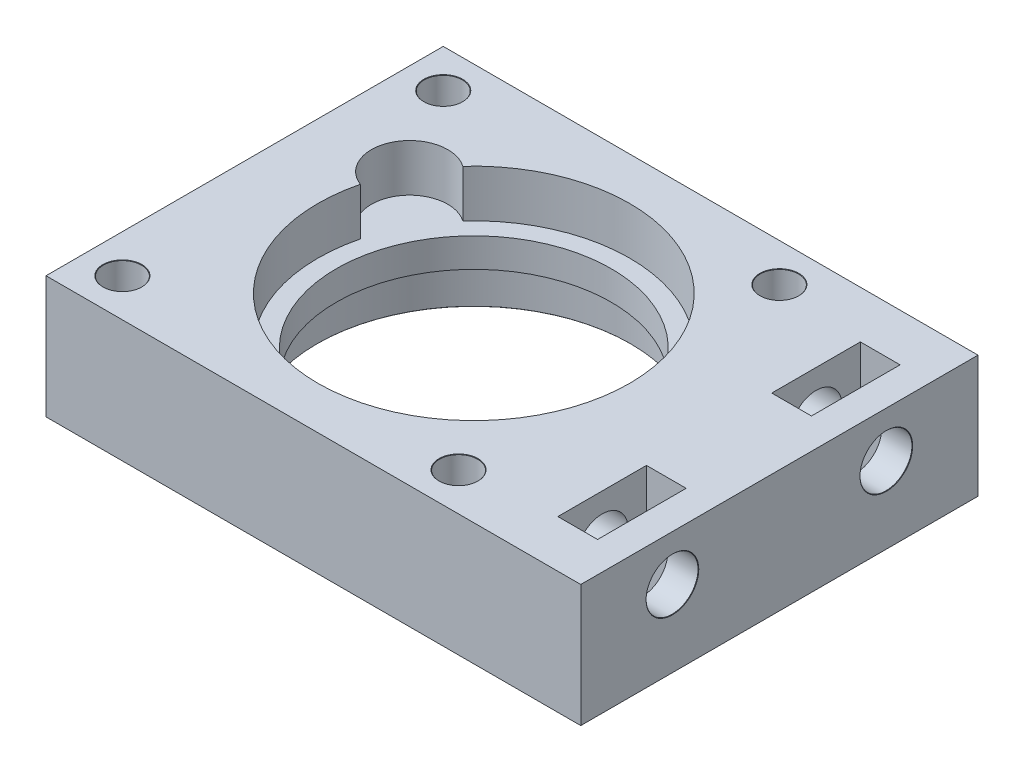
ISO-10303-21;
HEADER;
FILE_DESCRIPTION(('STEP AP214'),'2;1');
FILE_NAME('part.step','',(''),(''),'','','');
FILE_SCHEMA(('AUTOMOTIVE_DESIGN { 1 0 10303 214 1 1 1 1 }'));
ENDSEC;
DATA;
#1=APPLICATION_CONTEXT('core data for automotive mechanical design processes');
#2=APPLICATION_PROTOCOL_DEFINITION('international standard','automotive_design',2000,#1);
#3=PRODUCT_CONTEXT('',#1,'mechanical');
#4=PRODUCT('Part','Part','',(#3));
#5=PRODUCT_RELATED_PRODUCT_CATEGORY('part','',(#4));
#6=PRODUCT_DEFINITION_FORMATION('','',#4);
#7=PRODUCT_DEFINITION_CONTEXT('part definition',#1,'design');
#8=PRODUCT_DEFINITION('design','',#6,#7);
#9=PRODUCT_DEFINITION_SHAPE('','',#8);
#10=(LENGTH_UNIT() NAMED_UNIT(*) SI_UNIT(.MILLI.,.METRE.));
#11=(NAMED_UNIT(*) PLANE_ANGLE_UNIT() SI_UNIT($,.RADIAN.));
#12=(NAMED_UNIT(*) SI_UNIT($,.STERADIAN.) SOLID_ANGLE_UNIT());
#13=UNCERTAINTY_MEASURE_WITH_UNIT(LENGTH_MEASURE(1.E-05),#10,'distance_accuracy_value','');
#14=(GEOMETRIC_REPRESENTATION_CONTEXT(3) GLOBAL_UNCERTAINTY_ASSIGNED_CONTEXT((#13)) GLOBAL_UNIT_ASSIGNED_CONTEXT((#10,
#11,#12)) REPRESENTATION_CONTEXT('',''));
#15=CARTESIAN_POINT('',(0.,0.,0.));
#16=DIRECTION('',(0.,0.,1.));
#17=DIRECTION('',(1.,0.,0.));
#18=AXIS2_PLACEMENT_3D('',#15,#16,#17);
#19=CARTESIAN_POINT('',(35.,5.,-20.));
#20=DIRECTION('',(1.,0.,0.));
#21=DIRECTION('',(0.,0.,-1.));
#22=AXIS2_PLACEMENT_3D('',#19,#20,#21);
#23=CYLINDRICAL_SURFACE('',#22,1.69999999999999);
#24=CARTESIAN_POINT('',(33.,5.,-20.));
#25=DIRECTION('',(1.,0.,0.));
#26=DIRECTION('',(0.,0.,-1.));
#27=AXIS2_PLACEMENT_3D('',#24,#25,#26);
#28=CIRCLE('',#27,1.69999999999999);
#29=CARTESIAN_POINT('',(33.,5.,-21.7));
#30=VERTEX_POINT('',#29);
#31=EDGE_CURVE('E37',#30,#30,#28,.F.);
#32=ORIENTED_EDGE('',*,*,#31,.T.);
#33=EDGE_LOOP('',(#32));
#34=FACE_BOUND('',#33,.T.);
#35=CARTESIAN_POINT('',(34.975,5.,-20.));
#36=DIRECTION('',(1.,0.,0.));
#37=DIRECTION('',(0.,0.,-1.));
#38=AXIS2_PLACEMENT_3D('',#35,#36,#37);
#39=CIRCLE('',#38,1.69999999999999);
#40=CARTESIAN_POINT('',(34.975,5.,-21.7));
#41=VERTEX_POINT('',#40);
#42=EDGE_CURVE('E290',#41,#41,#39,.T.);
#43=ORIENTED_EDGE('',*,*,#42,.T.);
#44=EDGE_LOOP('',(#43));
#45=FACE_BOUND('',#44,.T.);
#46=ADVANCED_FACE('F33',(#34,#45),#23,.F.);
#47=CARTESIAN_POINT('',(0.,8.,0.));
#48=DIRECTION('',(1.,0.,0.));
#49=DIRECTION('',(0.,0.,-1.));
#50=AXIS2_PLACEMENT_3D('',#47,#48,#49);
#51=PLANE('',#50);
#52=DIRECTION('',(0.,0.,1.));
#53=VECTOR('',#52,1.);
#54=CARTESIAN_POINT('',(0.,0.,0.));
#55=LINE('',#54,#53);
#56=CARTESIAN_POINT('',(0.,0.,-26.));
#57=VERTEX_POINT('',#56);
#58=CARTESIAN_POINT('',(0.,0.,0.));
#59=VERTEX_POINT('',#58);
#60=EDGE_CURVE('E296',#57,#59,#55,.T.);
#61=ORIENTED_EDGE('',*,*,#60,.T.);
#62=DIRECTION('',(0.,-1.,0.));
#63=VECTOR('',#62,1.);
#64=CARTESIAN_POINT('',(0.,8.,0.));
#65=LINE('',#64,#63);
#66=CARTESIAN_POINT('',(0.,8.,0.));
#67=VERTEX_POINT('',#66);
#68=EDGE_CURVE('E11',#67,#59,#65,.T.);
#69=ORIENTED_EDGE('',*,*,#68,.F.);
#70=DIRECTION('',(0.,0.,1.));
#71=VECTOR('',#70,1.);
#72=CARTESIAN_POINT('',(0.,8.,0.));
#73=LINE('',#72,#71);
#74=CARTESIAN_POINT('',(0.,8.,-26.));
#75=VERTEX_POINT('',#74);
#76=EDGE_CURVE('E297',#75,#67,#73,.T.);
#77=ORIENTED_EDGE('',*,*,#76,.F.);
#78=DIRECTION('',(0.,-1.,0.));
#79=VECTOR('',#78,1.);
#80=CARTESIAN_POINT('',(0.,8.,-26.));
#81=LINE('',#80,#79);
#82=EDGE_CURVE('E307',#75,#57,#81,.T.);
#83=ORIENTED_EDGE('',*,*,#82,.T.);
#84=EDGE_LOOP('',(#61,#69,#77,#83));
#85=FACE_BOUND('',#84,.T.);
#86=ADVANCED_FACE('F35',(#85),#51,.F.);
#87=CARTESIAN_POINT('',(0.,8.,0.));
#88=DIRECTION('',(0.,0.,-1.));
#89=DIRECTION('',(-1.,0.,0.));
#90=AXIS2_PLACEMENT_3D('',#87,#88,#89);
#91=PLANE('',#90);
#92=DIRECTION('',(1.,0.,0.));
#93=VECTOR('',#92,1.);
#94=CARTESIAN_POINT('',(0.,0.,0.));
#95=LINE('',#94,#93);
#96=CARTESIAN_POINT('',(35.,0.,0.));
#97=VERTEX_POINT('',#96);
#98=EDGE_CURVE('E310',#59,#97,#95,.T.);
#99=ORIENTED_EDGE('',*,*,#98,.T.);
#100=DIRECTION('',(0.,-1.,0.));
#101=VECTOR('',#100,1.);
#102=CARTESIAN_POINT('',(35.,8.,0.));
#103=LINE('',#102,#101);
#104=CARTESIAN_POINT('',(35.,8.,0.));
#105=VERTEX_POINT('',#104);
#106=EDGE_CURVE('E42',#105,#97,#103,.T.);
#107=ORIENTED_EDGE('',*,*,#106,.F.);
#108=DIRECTION('',(1.,0.,0.));
#109=VECTOR('',#108,1.);
#110=CARTESIAN_POINT('',(0.,8.,0.));
#111=LINE('',#110,#109);
#112=EDGE_CURVE('E300',#67,#105,#111,.T.);
#113=ORIENTED_EDGE('',*,*,#112,.F.);
#114=ORIENTED_EDGE('',*,*,#68,.T.);
#115=EDGE_LOOP('',(#99,#107,#113,#114));
#116=FACE_BOUND('',#115,.T.);
#117=ADVANCED_FACE('F361',(#116),#91,.F.);
#118=CARTESIAN_POINT('',(35.,8.,0.));
#119=DIRECTION('',(-1.,0.,0.));
#120=DIRECTION('',(0.,0.,1.));
#121=AXIS2_PLACEMENT_3D('',#118,#119,#120);
#122=PLANE('',#121);
#123=CARTESIAN_POINT('',(35.,5.,-6.));
#124=DIRECTION('',(1.,0.,0.));
#125=DIRECTION('',(0.,0.,-1.));
#126=AXIS2_PLACEMENT_3D('',#123,#124,#125);
#127=CIRCLE('',#126,1.725);
#128=CARTESIAN_POINT('',(35.,5.,-7.725));
#129=VERTEX_POINT('',#128);
#130=EDGE_CURVE('E278',#129,#129,#127,.T.);
#131=ORIENTED_EDGE('',*,*,#130,.F.);
#132=EDGE_LOOP('',(#131));
#133=FACE_BOUND('',#132,.T.);
#134=CARTESIAN_POINT('',(35.,5.,-20.));
#135=DIRECTION('',(1.,0.,0.));
#136=DIRECTION('',(0.,0.,-1.));
#137=AXIS2_PLACEMENT_3D('',#134,#135,#136);
#138=CIRCLE('',#137,1.725);
#139=CARTESIAN_POINT('',(35.,5.,-21.725));
#140=VERTEX_POINT('',#139);
#141=EDGE_CURVE('E287',#140,#140,#138,.T.);
#142=ORIENTED_EDGE('',*,*,#141,.F.);
#143=EDGE_LOOP('',(#142));
#144=FACE_BOUND('',#143,.T.);
#145=DIRECTION('',(0.,0.,-1.));
#146=VECTOR('',#145,1.);
#147=CARTESIAN_POINT('',(35.,0.,0.));
#148=LINE('',#147,#146);
#149=CARTESIAN_POINT('',(35.,0.,-26.));
#150=VERTEX_POINT('',#149);
#151=EDGE_CURVE('E312',#97,#150,#148,.T.);
#152=ORIENTED_EDGE('',*,*,#151,.T.);
#153=DIRECTION('',(0.,-1.,0.));
#154=VECTOR('',#153,1.);
#155=CARTESIAN_POINT('',(35.,8.,-26.));
#156=LINE('',#155,#154);
#157=CARTESIAN_POINT('',(35.,8.,-26.));
#158=VERTEX_POINT('',#157);
#159=EDGE_CURVE('E317',#158,#150,#156,.T.);
#160=ORIENTED_EDGE('',*,*,#159,.F.);
#161=DIRECTION('',(0.,0.,-1.));
#162=VECTOR('',#161,1.);
#163=CARTESIAN_POINT('',(35.,8.,0.));
#164=LINE('',#163,#162);
#165=EDGE_CURVE('E303',#105,#158,#164,.T.);
#166=ORIENTED_EDGE('',*,*,#165,.F.);
#167=ORIENTED_EDGE('',*,*,#106,.T.);
#168=EDGE_LOOP('',(#152,#160,#166,#167));
#169=FACE_BOUND('',#168,.T.);
#170=ADVANCED_FACE('F390',(#133,#144,#169),#122,.F.);
#171=CARTESIAN_POINT('',(0.,8.,-26.));
#172=DIRECTION('',(0.,0.,1.));
#173=DIRECTION('',(1.,0.,0.));
#174=AXIS2_PLACEMENT_3D('',#171,#172,#173);
#175=PLANE('',#174);
#176=DIRECTION('',(-1.,0.,0.));
#177=VECTOR('',#176,1.);
#178=CARTESIAN_POINT('',(0.,0.,-26.));
#179=LINE('',#178,#177);
#180=EDGE_CURVE('E301',#150,#57,#179,.T.);
#181=ORIENTED_EDGE('',*,*,#180,.T.);
#182=ORIENTED_EDGE('',*,*,#82,.F.);
#183=DIRECTION('',(-1.,0.,0.));
#184=VECTOR('',#183,1.);
#185=CARTESIAN_POINT('',(0.,8.,-26.));
#186=LINE('',#185,#184);
#187=EDGE_CURVE('E305',#158,#75,#186,.T.);
#188=ORIENTED_EDGE('',*,*,#187,.F.);
#189=ORIENTED_EDGE('',*,*,#159,.T.);
#190=EDGE_LOOP('',(#181,#182,#188,#189));
#191=FACE_BOUND('',#190,.T.);
#192=ADVANCED_FACE('F383',(#191),#175,.F.);
#193=CARTESIAN_POINT('',(0.,8.,0.));
#194=DIRECTION('',(0.,-1.,0.));
#195=DIRECTION('',(0.,0.,-1.));
#196=AXIS2_PLACEMENT_3D('',#193,#194,#195);
#197=PLANE('',#196);
#198=DIRECTION('',(1.,0.,0.));
#199=VECTOR('',#198,1.);
#200=CARTESIAN_POINT('',(30.4,8.,-3.1));
#201=LINE('',#200,#199);
#202=CARTESIAN_POINT('',(30.4,8.,-3.1));
#203=VERTEX_POINT('',#202);
#204=CARTESIAN_POINT('',(33.,8.,-3.1));
#205=VERTEX_POINT('',#204);
#206=EDGE_CURVE('E173',#203,#205,#201,.T.);
#207=ORIENTED_EDGE('',*,*,#206,.F.);
#208=DIRECTION('',(0.,0.,1.));
#209=VECTOR('',#208,1.);
#210=CARTESIAN_POINT('',(30.4,8.,-8.9));
#211=LINE('',#210,#209);
#212=CARTESIAN_POINT('',(30.4,8.,-8.9));
#213=VERTEX_POINT('',#212);
#214=EDGE_CURVE('E50',#213,#203,#211,.T.);
#215=ORIENTED_EDGE('',*,*,#214,.F.);
#216=DIRECTION('',(-1.,0.,0.));
#217=VECTOR('',#216,1.);
#218=CARTESIAN_POINT('',(30.4,8.,-8.9));
#219=LINE('',#218,#217);
#220=CARTESIAN_POINT('',(33.,8.,-8.9));
#221=VERTEX_POINT('',#220);
#222=EDGE_CURVE('E164',#221,#213,#219,.T.);
#223=ORIENTED_EDGE('',*,*,#222,.F.);
#224=DIRECTION('',(0.,0.,-1.));
#225=VECTOR('',#224,1.);
#226=CARTESIAN_POINT('',(33.,8.,-8.9));
#227=LINE('',#226,#225);
#228=EDGE_CURVE('E167',#205,#221,#227,.T.);
#229=ORIENTED_EDGE('',*,*,#228,.F.);
#230=EDGE_LOOP('',(#207,#215,#223,#229));
#231=FACE_BOUND('',#230,.T.);
#232=DIRECTION('',(-1.,0.,0.));
#233=VECTOR('',#232,1.);
#234=CARTESIAN_POINT('',(33.,8.,-22.9));
#235=LINE('',#234,#233);
#236=CARTESIAN_POINT('',(33.,8.,-22.9));
#237=VERTEX_POINT('',#236);
#238=CARTESIAN_POINT('',(30.4,8.,-22.9));
#239=VERTEX_POINT('',#238);
#240=EDGE_CURVE('E199',#237,#239,#235,.T.);
#241=ORIENTED_EDGE('',*,*,#240,.F.);
#242=DIRECTION('',(0.,0.,-1.));
#243=VECTOR('',#242,1.);
#244=CARTESIAN_POINT('',(33.,8.,-22.9));
#245=LINE('',#244,#243);
#246=CARTESIAN_POINT('',(33.,8.,-17.1));
#247=VERTEX_POINT('',#246);
#248=EDGE_CURVE('E58',#247,#237,#245,.T.);
#249=ORIENTED_EDGE('',*,*,#248,.F.);
#250=DIRECTION('',(1.,0.,0.));
#251=VECTOR('',#250,1.);
#252=CARTESIAN_POINT('',(33.,8.,-17.1));
#253=LINE('',#252,#251);
#254=CARTESIAN_POINT('',(30.4,8.,-17.1));
#255=VERTEX_POINT('',#254);
#256=EDGE_CURVE('E188',#255,#247,#253,.T.);
#257=ORIENTED_EDGE('',*,*,#256,.F.);
#258=DIRECTION('',(0.,0.,1.));
#259=VECTOR('',#258,1.);
#260=CARTESIAN_POINT('',(30.4,8.,-22.9));
#261=LINE('',#260,#259);
#262=EDGE_CURVE('E202',#239,#255,#261,.T.);
#263=ORIENTED_EDGE('',*,*,#262,.F.);
#264=EDGE_LOOP('',(#241,#249,#257,#263));
#265=FACE_BOUND('',#264,.T.);
#266=CARTESIAN_POINT('',(2.5,8.,-23.5));
#267=DIRECTION('',(0.,1.,0.));
#268=DIRECTION('',(0.,0.,1.));
#269=AXIS2_PLACEMENT_3D('',#266,#267,#268);
#270=CIRCLE('',#269,1.275);
#271=CARTESIAN_POINT('',(2.5,8.,-22.225));
#272=VERTEX_POINT('',#271);
#273=EDGE_CURVE('E213',#272,#272,#270,.T.);
#274=ORIENTED_EDGE('',*,*,#273,.F.);
#275=EDGE_LOOP('',(#274));
#276=FACE_BOUND('',#275,.T.);
#277=CARTESIAN_POINT('',(24.5,8.,-23.5));
#278=DIRECTION('',(0.,1.,0.));
#279=DIRECTION('',(0.,0.,1.));
#280=AXIS2_PLACEMENT_3D('',#277,#278,#279);
#281=CIRCLE('',#280,1.275);
#282=CARTESIAN_POINT('',(24.5,8.,-22.225));
#283=VERTEX_POINT('',#282);
#284=EDGE_CURVE('E222',#283,#283,#281,.T.);
#285=ORIENTED_EDGE('',*,*,#284,.F.);
#286=EDGE_LOOP('',(#285));
#287=FACE_BOUND('',#286,.T.);
#288=CARTESIAN_POINT('',(24.5,8.,-2.5));
#289=DIRECTION('',(0.,1.,0.));
#290=DIRECTION('',(0.,0.,1.));
#291=AXIS2_PLACEMENT_3D('',#288,#289,#290);
#292=CIRCLE('',#291,1.275);
#293=CARTESIAN_POINT('',(24.5,8.,-1.225));
#294=VERTEX_POINT('',#293);
#295=EDGE_CURVE('E231',#294,#294,#292,.T.);
#296=ORIENTED_EDGE('',*,*,#295,.F.);
#297=EDGE_LOOP('',(#296));
#298=FACE_BOUND('',#297,.T.);
#299=CARTESIAN_POINT('',(2.5,8.,-2.5));
#300=DIRECTION('',(0.,1.,0.));
#301=DIRECTION('',(0.,0.,1.));
#302=AXIS2_PLACEMENT_3D('',#299,#300,#301);
#303=CIRCLE('',#302,1.275);
#304=CARTESIAN_POINT('',(2.5,8.,-1.225));
#305=VERTEX_POINT('',#304);
#306=EDGE_CURVE('E240',#305,#305,#303,.T.);
#307=ORIENTED_EDGE('',*,*,#306,.F.);
#308=EDGE_LOOP('',(#307));
#309=FACE_BOUND('',#308,.T.);
#310=CARTESIAN_POINT('',(15.,8.,-13.));
#311=DIRECTION('',(0.,1.,0.));
#312=DIRECTION('',(0.,0.,1.));
#313=AXIS2_PLACEMENT_3D('',#310,#311,#312);
#314=CIRCLE('',#313,10.2);
#315=CARTESIAN_POINT('',(5.10272582365916,8.,-15.4665692526942));
#316=VERTEX_POINT('',#315);
#317=CARTESIAN_POINT('',(7.43793161578721,8.,-19.8450801129343));
#318=VERTEX_POINT('',#317);
#319=EDGE_CURVE('E267',#316,#318,#314,.T.);
#320=ORIENTED_EDGE('',*,*,#319,.F.);
#321=CARTESIAN_POINT('',(6.,8.,-17.8));
#322=DIRECTION('',(0.,1.,0.));
#323=DIRECTION('',(0.,0.,1.));
#324=AXIS2_PLACEMENT_3D('',#321,#322,#323);
#325=CIRCLE('',#324,2.5);
#326=EDGE_CURVE('E249',#318,#316,#325,.T.);
#327=ORIENTED_EDGE('',*,*,#326,.F.);
#328=EDGE_LOOP('',(#320,#327));
#329=FACE_BOUND('',#328,.T.);
#330=ORIENTED_EDGE('',*,*,#76,.T.);
#331=ORIENTED_EDGE('',*,*,#112,.T.);
#332=ORIENTED_EDGE('',*,*,#165,.T.);
#333=ORIENTED_EDGE('',*,*,#187,.T.);
#334=EDGE_LOOP('',(#330,#331,#332,#333));
#335=FACE_BOUND('',#334,.T.);
#336=ADVANCED_FACE('F380',(#231,#265,#276,#287,#298,#309,#329,#335),#197,.F.);
#337=CARTESIAN_POINT('',(0.,0.,0.));
#338=DIRECTION('',(0.,-1.,0.));
#339=DIRECTION('',(0.,0.,-1.));
#340=AXIS2_PLACEMENT_3D('',#337,#338,#339);
#341=PLANE('',#340);
#342=DIRECTION('',(0.,0.,1.));
#343=VECTOR('',#342,1.);
#344=CARTESIAN_POINT('',(30.4,0.,-8.9));
#345=LINE('',#344,#343);
#346=CARTESIAN_POINT('',(30.4,0.,-8.9));
#347=VERTEX_POINT('',#346);
#348=CARTESIAN_POINT('',(30.4,0.,-3.1));
#349=VERTEX_POINT('',#348);
#350=EDGE_CURVE('E145',#347,#349,#345,.T.);
#351=ORIENTED_EDGE('',*,*,#350,.T.);
#352=DIRECTION('',(1.,0.,0.));
#353=VECTOR('',#352,1.);
#354=CARTESIAN_POINT('',(30.4,0.,-3.1));
#355=LINE('',#354,#353);
#356=CARTESIAN_POINT('',(33.,0.,-3.1));
#357=VERTEX_POINT('',#356);
#358=EDGE_CURVE('E155',#349,#357,#355,.T.);
#359=ORIENTED_EDGE('',*,*,#358,.T.);
#360=DIRECTION('',(0.,0.,-1.));
#361=VECTOR('',#360,1.);
#362=CARTESIAN_POINT('',(33.,0.,-8.9));
#363=LINE('',#362,#361);
#364=CARTESIAN_POINT('',(33.,0.,-8.9));
#365=VERTEX_POINT('',#364);
#366=EDGE_CURVE('E159',#357,#365,#363,.T.);
#367=ORIENTED_EDGE('',*,*,#366,.T.);
#368=DIRECTION('',(-1.,0.,0.));
#369=VECTOR('',#368,1.);
#370=CARTESIAN_POINT('',(30.4,0.,-8.9));
#371=LINE('',#370,#369);
#372=EDGE_CURVE('E151',#365,#347,#371,.T.);
#373=ORIENTED_EDGE('',*,*,#372,.T.);
#374=EDGE_LOOP('',(#351,#359,#367,#373));
#375=FACE_BOUND('',#374,.T.);
#376=DIRECTION('',(0.,0.,-1.));
#377=VECTOR('',#376,1.);
#378=CARTESIAN_POINT('',(33.,0.,-22.9));
#379=LINE('',#378,#377);
#380=CARTESIAN_POINT('',(33.,0.,-17.1));
#381=VERTEX_POINT('',#380);
#382=CARTESIAN_POINT('',(33.,0.,-22.9));
#383=VERTEX_POINT('',#382);
#384=EDGE_CURVE('E184',#381,#383,#379,.T.);
#385=ORIENTED_EDGE('',*,*,#384,.T.);
#386=DIRECTION('',(-1.,0.,0.));
#387=VECTOR('',#386,1.);
#388=CARTESIAN_POINT('',(33.,0.,-22.9));
#389=LINE('',#388,#387);
#390=CARTESIAN_POINT('',(30.4,0.,-22.9));
#391=VERTEX_POINT('',#390);
#392=EDGE_CURVE('E187',#383,#391,#389,.T.);
#393=ORIENTED_EDGE('',*,*,#392,.T.);
#394=DIRECTION('',(0.,0.,1.));
#395=VECTOR('',#394,1.);
#396=CARTESIAN_POINT('',(30.4,0.,-22.9));
#397=LINE('',#396,#395);
#398=CARTESIAN_POINT('',(30.4,0.,-17.1));
#399=VERTEX_POINT('',#398);
#400=EDGE_CURVE('E191',#391,#399,#397,.T.);
#401=ORIENTED_EDGE('',*,*,#400,.T.);
#402=DIRECTION('',(1.,0.,0.));
#403=VECTOR('',#402,1.);
#404=CARTESIAN_POINT('',(33.,0.,-17.1));
#405=LINE('',#404,#403);
#406=EDGE_CURVE('E194',#399,#381,#405,.T.);
#407=ORIENTED_EDGE('',*,*,#406,.T.);
#408=EDGE_LOOP('',(#385,#393,#401,#407));
#409=FACE_BOUND('',#408,.T.);
#410=CARTESIAN_POINT('',(2.5,0.,-23.5));
#411=DIRECTION('',(0.,1.,0.));
#412=DIRECTION('',(0.,0.,1.));
#413=AXIS2_PLACEMENT_3D('',#410,#411,#412);
#414=CIRCLE('',#413,1.25);
#415=CARTESIAN_POINT('',(2.5,0.,-22.25));
#416=VERTEX_POINT('',#415);
#417=EDGE_CURVE('E219',#416,#416,#414,.T.);
#418=ORIENTED_EDGE('',*,*,#417,.T.);
#419=EDGE_LOOP('',(#418));
#420=FACE_BOUND('',#419,.T.);
#421=CARTESIAN_POINT('',(24.5,0.,-23.5));
#422=DIRECTION('',(0.,1.,0.));
#423=DIRECTION('',(0.,0.,1.));
#424=AXIS2_PLACEMENT_3D('',#421,#422,#423);
#425=CIRCLE('',#424,1.25);
#426=CARTESIAN_POINT('',(24.5,0.,-22.25));
#427=VERTEX_POINT('',#426);
#428=EDGE_CURVE('E228',#427,#427,#425,.T.);
#429=ORIENTED_EDGE('',*,*,#428,.T.);
#430=EDGE_LOOP('',(#429));
#431=FACE_BOUND('',#430,.T.);
#432=CARTESIAN_POINT('',(24.5,0.,-2.5));
#433=DIRECTION('',(0.,1.,0.));
#434=DIRECTION('',(0.,0.,1.));
#435=AXIS2_PLACEMENT_3D('',#432,#433,#434);
#436=CIRCLE('',#435,1.25);
#437=CARTESIAN_POINT('',(24.5,0.,-1.25));
#438=VERTEX_POINT('',#437);
#439=EDGE_CURVE('E237',#438,#438,#436,.T.);
#440=ORIENTED_EDGE('',*,*,#439,.T.);
#441=EDGE_LOOP('',(#440));
#442=FACE_BOUND('',#441,.T.);
#443=CARTESIAN_POINT('',(2.5,0.,-2.5));
#444=DIRECTION('',(0.,1.,0.));
#445=DIRECTION('',(0.,0.,1.));
#446=AXIS2_PLACEMENT_3D('',#443,#444,#445);
#447=CIRCLE('',#446,1.25);
#448=CARTESIAN_POINT('',(2.5,0.,-1.25));
#449=VERTEX_POINT('',#448);
#450=EDGE_CURVE('E246',#449,#449,#447,.T.);
#451=ORIENTED_EDGE('',*,*,#450,.T.);
#452=EDGE_LOOP('',(#451));
#453=FACE_BOUND('',#452,.T.);
#454=CARTESIAN_POINT('',(15.,0.,-13.));
#455=DIRECTION('',(0.,-1.,0.));
#456=DIRECTION('',(0.,0.,-1.));
#457=AXIS2_PLACEMENT_3D('',#454,#455,#456);
#458=CIRCLE('',#457,10.275);
#459=CARTESIAN_POINT('',(15.,0.,-23.275));
#460=VERTEX_POINT('',#459);
#461=EDGE_CURVE('E266',#460,#460,#458,.T.);
#462=ORIENTED_EDGE('',*,*,#461,.F.);
#463=EDGE_LOOP('',(#462));
#464=FACE_BOUND('',#463,.T.);
#465=ORIENTED_EDGE('',*,*,#60,.F.);
#466=ORIENTED_EDGE('',*,*,#180,.F.);
#467=ORIENTED_EDGE('',*,*,#151,.F.);
#468=ORIENTED_EDGE('',*,*,#98,.F.);
#469=EDGE_LOOP('',(#465,#466,#467,#468));
#470=FACE_BOUND('',#469,.T.);
#471=ADVANCED_FACE('F161',(#375,#409,#420,#431,#442,#453,#464,#470),#341,.T.);
#472=CARTESIAN_POINT('',(35.,5.,-20.));
#473=DIRECTION('',(1.,0.,0.));
#474=DIRECTION('',(0.,0.,-1.));
#475=AXIS2_PLACEMENT_3D('',#472,#473,#474);
#476=CONICAL_SURFACE('',#475,1.725,0.785398163397171);
#477=ORIENTED_EDGE('',*,*,#42,.F.);
#478=EDGE_LOOP('',(#477));
#479=FACE_BOUND('',#478,.T.);
#480=ORIENTED_EDGE('',*,*,#141,.T.);
#481=EDGE_LOOP('',(#480));
#482=FACE_BOUND('',#481,.T.);
#483=ADVANCED_FACE('F387',(#479,#482),#476,.F.);
#484=CARTESIAN_POINT('',(35.,5.,-6.));
#485=DIRECTION('',(1.,0.,0.));
#486=DIRECTION('',(0.,0.,-1.));
#487=AXIS2_PLACEMENT_3D('',#484,#485,#486);
#488=CYLINDRICAL_SURFACE('',#487,1.69999999999999);
#489=CARTESIAN_POINT('',(33.,5.,-6.));
#490=DIRECTION('',(1.,0.,0.));
#491=DIRECTION('',(0.,0.,-1.));
#492=AXIS2_PLACEMENT_3D('',#489,#490,#491);
#493=CIRCLE('',#492,1.69999999999999);
#494=CARTESIAN_POINT('',(33.,5.,-7.69999999999999));
#495=VERTEX_POINT('',#494);
#496=EDGE_CURVE('E180',#495,#495,#493,.F.);
#497=ORIENTED_EDGE('',*,*,#496,.T.);
#498=EDGE_LOOP('',(#497));
#499=FACE_BOUND('',#498,.T.);
#500=CARTESIAN_POINT('',(34.975,5.,-6.));
#501=DIRECTION('',(1.,0.,0.));
#502=DIRECTION('',(0.,0.,-1.));
#503=AXIS2_PLACEMENT_3D('',#500,#501,#502);
#504=CIRCLE('',#503,1.69999999999999);
#505=CARTESIAN_POINT('',(34.975,5.,-7.69999999999999));
#506=VERTEX_POINT('',#505);
#507=EDGE_CURVE('E281',#506,#506,#504,.T.);
#508=ORIENTED_EDGE('',*,*,#507,.T.);
#509=EDGE_LOOP('',(#508));
#510=FACE_BOUND('',#509,.T.);
#511=ADVANCED_FACE('F352',(#499,#510),#488,.F.);
#512=CARTESIAN_POINT('',(35.,5.,-6.));
#513=DIRECTION('',(1.,0.,0.));
#514=DIRECTION('',(0.,0.,-1.));
#515=AXIS2_PLACEMENT_3D('',#512,#513,#514);
#516=CONICAL_SURFACE('',#515,1.725,0.785398163397171);
#517=ORIENTED_EDGE('',*,*,#507,.F.);
#518=EDGE_LOOP('',(#517));
#519=FACE_BOUND('',#518,.T.);
#520=ORIENTED_EDGE('',*,*,#130,.T.);
#521=EDGE_LOOP('',(#520));
#522=FACE_BOUND('',#521,.T.);
#523=ADVANCED_FACE('F442',(#519,#522),#516,.F.);
#524=CARTESIAN_POINT('',(15.,3.,-13.));
#525=DIRECTION('',(0.,1.,0.));
#526=DIRECTION('',(0.,0.,1.));
#527=AXIS2_PLACEMENT_3D('',#524,#525,#526);
#528=PLANE('',#527);
#529=CARTESIAN_POINT('',(15.,3.,-13.));
#530=DIRECTION('',(0.,1.,0.));
#531=DIRECTION('',(0.,0.,1.));
#532=AXIS2_PLACEMENT_3D('',#529,#530,#531);
#533=CIRCLE('',#532,9.);
#534=CARTESIAN_POINT('',(15.,3.,-4.));
#535=VERTEX_POINT('',#534);
#536=EDGE_CURVE('E262',#535,#535,#533,.T.);
#537=ORIENTED_EDGE('',*,*,#536,.T.);
#538=EDGE_LOOP('',(#537));
#539=FACE_BOUND('',#538,.T.);
#540=CARTESIAN_POINT('',(15.,3.,-13.));
#541=DIRECTION('',(0.,-1.,0.));
#542=DIRECTION('',(0.,0.,-1.));
#543=AXIS2_PLACEMENT_3D('',#540,#541,#542);
#544=CIRCLE('',#543,10.25);
#545=CARTESIAN_POINT('',(15.,3.,-23.25));
#546=VERTEX_POINT('',#545);
#547=EDGE_CURVE('E275',#546,#546,#544,.T.);
#548=ORIENTED_EDGE('',*,*,#547,.T.);
#549=EDGE_LOOP('',(#548));
#550=FACE_BOUND('',#549,.T.);
#551=ADVANCED_FACE('F450',(#539,#550),#528,.F.);
#552=CARTESIAN_POINT('',(15.,0.,-13.));
#553=DIRECTION('',(0.,-1.,0.));
#554=DIRECTION('',(0.,0.,-1.));
#555=AXIS2_PLACEMENT_3D('',#552,#553,#554);
#556=CYLINDRICAL_SURFACE('',#555,10.25);
#557=ORIENTED_EDGE('',*,*,#547,.F.);
#558=EDGE_LOOP('',(#557));
#559=FACE_BOUND('',#558,.T.);
#560=CARTESIAN_POINT('',(15.,0.0249999999999933,-13.));
#561=DIRECTION('',(0.,-1.,0.));
#562=DIRECTION('',(0.,0.,-1.));
#563=AXIS2_PLACEMENT_3D('',#560,#561,#562);
#564=CIRCLE('',#563,10.25);
#565=CARTESIAN_POINT('',(15.,0.0249999999999933,-23.25));
#566=VERTEX_POINT('',#565);
#567=EDGE_CURVE('E272',#566,#566,#564,.T.);
#568=ORIENTED_EDGE('',*,*,#567,.T.);
#569=EDGE_LOOP('',(#568));
#570=FACE_BOUND('',#569,.T.);
#571=ADVANCED_FACE('F459',(#559,#570),#556,.F.);
#572=CARTESIAN_POINT('',(15.,0.,-13.));
#573=DIRECTION('',(0.,-1.,0.));
#574=DIRECTION('',(0.,0.,-1.));
#575=AXIS2_PLACEMENT_3D('',#572,#573,#574);
#576=CONICAL_SURFACE('',#575,10.275,0.785398163397665);
#577=ORIENTED_EDGE('',*,*,#567,.F.);
#578=EDGE_LOOP('',(#577));
#579=FACE_BOUND('',#578,.T.);
#580=ORIENTED_EDGE('',*,*,#461,.T.);
#581=EDGE_LOOP('',(#580));
#582=FACE_BOUND('',#581,.T.);
#583=ADVANCED_FACE('F468',(#579,#582),#576,.F.);
#584=CARTESIAN_POINT('',(15.,4.9,-13.));
#585=DIRECTION('',(0.,1.,0.));
#586=DIRECTION('',(0.,0.,1.));
#587=AXIS2_PLACEMENT_3D('',#584,#585,#586);
#588=CYLINDRICAL_SURFACE('',#587,10.2);
#589=CARTESIAN_POINT('',(15.,4.9,-13.));
#590=DIRECTION('',(0.,1.,0.));
#591=DIRECTION('',(0.,0.,1.));
#592=AXIS2_PLACEMENT_3D('',#589,#590,#591);
#593=CIRCLE('',#592,10.2);
#594=CARTESIAN_POINT('',(5.10272582365916,4.9,-15.4665692526942));
#595=VERTEX_POINT('',#594);
#596=CARTESIAN_POINT('',(7.43793161578721,4.9,-19.8450801129343));
#597=VERTEX_POINT('',#596);
#598=EDGE_CURVE('E263',#595,#597,#593,.T.);
#599=ORIENTED_EDGE('',*,*,#598,.F.);
#600=DIRECTION('',(0.,1.,0.));
#601=VECTOR('',#600,1.);
#602=CARTESIAN_POINT('',(5.10272582365916,6.45,-15.4665692526942));
#603=LINE('',#602,#601);
#604=EDGE_CURVE('E256',#595,#316,#603,.T.);
#605=ORIENTED_EDGE('',*,*,#604,.T.);
#606=ORIENTED_EDGE('',*,*,#319,.T.);
#607=DIRECTION('',(0.,1.,0.));
#608=VECTOR('',#607,1.);
#609=CARTESIAN_POINT('',(7.43793161578721,6.45,-19.8450801129343));
#610=LINE('',#609,#608);
#611=EDGE_CURVE('E252',#318,#597,#610,.F.);
#612=ORIENTED_EDGE('',*,*,#611,.T.);
#613=EDGE_LOOP('',(#599,#605,#606,#612));
#614=FACE_BOUND('',#613,.T.);
#615=ADVANCED_FACE('F475',(#614),#588,.F.);
#616=CARTESIAN_POINT('',(15.,4.9,-13.));
#617=DIRECTION('',(0.,1.,0.));
#618=DIRECTION('',(0.,0.,1.));
#619=AXIS2_PLACEMENT_3D('',#616,#617,#618);
#620=PLANE('',#619);
#621=ORIENTED_EDGE('',*,*,#598,.T.);
#622=CARTESIAN_POINT('',(6.,4.9,-17.8));
#623=DIRECTION('',(0.,1.,0.));
#624=DIRECTION('',(0.,0.,1.));
#625=AXIS2_PLACEMENT_3D('',#622,#623,#624);
#626=CIRCLE('',#625,2.5);
#627=EDGE_CURVE('E250',#597,#595,#626,.T.);
#628=ORIENTED_EDGE('',*,*,#627,.T.);
#629=EDGE_LOOP('',(#621,#628));
#630=FACE_BOUND('',#629,.T.);
#631=CARTESIAN_POINT('',(15.,4.9,-13.));
#632=DIRECTION('',(0.,1.,0.));
#633=DIRECTION('',(0.,0.,1.));
#634=AXIS2_PLACEMENT_3D('',#631,#632,#633);
#635=CIRCLE('',#634,9.);
#636=CARTESIAN_POINT('',(15.,4.9,-4.));
#637=VERTEX_POINT('',#636);
#638=EDGE_CURVE('E259',#637,#637,#635,.T.);
#639=ORIENTED_EDGE('',*,*,#638,.F.);
#640=EDGE_LOOP('',(#639));
#641=FACE_BOUND('',#640,.T.);
#642=ADVANCED_FACE('F482',(#630,#641),#620,.T.);
#643=CARTESIAN_POINT('',(15.,0.,-13.));
#644=DIRECTION('',(0.,1.,0.));
#645=DIRECTION('',(0.,0.,1.));
#646=AXIS2_PLACEMENT_3D('',#643,#644,#645);
#647=CYLINDRICAL_SURFACE('',#646,9.);
#648=ORIENTED_EDGE('',*,*,#638,.T.);
#649=EDGE_LOOP('',(#648));
#650=FACE_BOUND('',#649,.T.);
#651=ORIENTED_EDGE('',*,*,#536,.F.);
#652=EDGE_LOOP('',(#651));
#653=FACE_BOUND('',#652,.T.);
#654=ADVANCED_FACE('F490',(#650,#653),#647,.F.);
#655=CARTESIAN_POINT('',(6.,4.9,-17.8));
#656=DIRECTION('',(0.,1.,0.));
#657=DIRECTION('',(0.,0.,1.));
#658=AXIS2_PLACEMENT_3D('',#655,#656,#657);
#659=CYLINDRICAL_SURFACE('',#658,2.5);
#660=ORIENTED_EDGE('',*,*,#627,.F.);
#661=ORIENTED_EDGE('',*,*,#611,.F.);
#662=ORIENTED_EDGE('',*,*,#326,.T.);
#663=ORIENTED_EDGE('',*,*,#604,.F.);
#664=EDGE_LOOP('',(#660,#661,#662,#663));
#665=FACE_BOUND('',#664,.T.);
#666=ADVANCED_FACE('F498',(#665),#659,.F.);
#667=CARTESIAN_POINT('',(2.5,8.,-2.5));
#668=DIRECTION('',(0.,1.,0.));
#669=DIRECTION('',(0.,0.,1.));
#670=AXIS2_PLACEMENT_3D('',#667,#668,#669);
#671=CYLINDRICAL_SURFACE('',#670,1.25);
#672=ORIENTED_EDGE('',*,*,#450,.F.);
#673=EDGE_LOOP('',(#672));
#674=FACE_BOUND('',#673,.T.);
#675=CARTESIAN_POINT('',(2.5,7.975,-2.5));
#676=DIRECTION('',(0.,1.,0.));
#677=DIRECTION('',(0.,0.,1.));
#678=AXIS2_PLACEMENT_3D('',#675,#676,#677);
#679=CIRCLE('',#678,1.25);
#680=CARTESIAN_POINT('',(2.5,7.975,-1.25));
#681=VERTEX_POINT('',#680);
#682=EDGE_CURVE('E243',#681,#681,#679,.T.);
#683=ORIENTED_EDGE('',*,*,#682,.T.);
#684=EDGE_LOOP('',(#683));
#685=FACE_BOUND('',#684,.T.);
#686=ADVANCED_FACE('F506',(#674,#685),#671,.F.);
#687=CARTESIAN_POINT('',(2.5,8.,-2.5));
#688=DIRECTION('',(0.,1.,0.));
#689=DIRECTION('',(0.,0.,1.));
#690=AXIS2_PLACEMENT_3D('',#687,#688,#689);
#691=CONICAL_SURFACE('',#690,1.275,0.785398163397448);
#692=ORIENTED_EDGE('',*,*,#682,.F.);
#693=EDGE_LOOP('',(#692));
#694=FACE_BOUND('',#693,.T.);
#695=ORIENTED_EDGE('',*,*,#306,.T.);
#696=EDGE_LOOP('',(#695));
#697=FACE_BOUND('',#696,.T.);
#698=ADVANCED_FACE('F514',(#694,#697),#691,.F.);
#699=CARTESIAN_POINT('',(24.5,8.,-2.5));
#700=DIRECTION('',(0.,1.,0.));
#701=DIRECTION('',(0.,0.,1.));
#702=AXIS2_PLACEMENT_3D('',#699,#700,#701);
#703=CYLINDRICAL_SURFACE('',#702,1.25);
#704=ORIENTED_EDGE('',*,*,#439,.F.);
#705=EDGE_LOOP('',(#704));
#706=FACE_BOUND('',#705,.T.);
#707=CARTESIAN_POINT('',(24.5,7.975,-2.5));
#708=DIRECTION('',(0.,1.,0.));
#709=DIRECTION('',(0.,0.,1.));
#710=AXIS2_PLACEMENT_3D('',#707,#708,#709);
#711=CIRCLE('',#710,1.25);
#712=CARTESIAN_POINT('',(24.5,7.975,-1.25));
#713=VERTEX_POINT('',#712);
#714=EDGE_CURVE('E234',#713,#713,#711,.T.);
#715=ORIENTED_EDGE('',*,*,#714,.T.);
#716=EDGE_LOOP('',(#715));
#717=FACE_BOUND('',#716,.T.);
#718=ADVANCED_FACE('F522',(#706,#717),#703,.F.);
#719=CARTESIAN_POINT('',(24.5,8.,-2.5));
#720=DIRECTION('',(0.,1.,0.));
#721=DIRECTION('',(0.,0.,1.));
#722=AXIS2_PLACEMENT_3D('',#719,#720,#721);
#723=CONICAL_SURFACE('',#722,1.275,0.785398163397448);
#724=ORIENTED_EDGE('',*,*,#714,.F.);
#725=EDGE_LOOP('',(#724));
#726=FACE_BOUND('',#725,.T.);
#727=ORIENTED_EDGE('',*,*,#295,.T.);
#728=EDGE_LOOP('',(#727));
#729=FACE_BOUND('',#728,.T.);
#730=ADVANCED_FACE('F530',(#726,#729),#723,.F.);
#731=CARTESIAN_POINT('',(24.5,8.,-23.5));
#732=DIRECTION('',(0.,1.,0.));
#733=DIRECTION('',(0.,0.,1.));
#734=AXIS2_PLACEMENT_3D('',#731,#732,#733);
#735=CYLINDRICAL_SURFACE('',#734,1.25);
#736=ORIENTED_EDGE('',*,*,#428,.F.);
#737=EDGE_LOOP('',(#736));
#738=FACE_BOUND('',#737,.T.);
#739=CARTESIAN_POINT('',(24.5,7.975,-23.5));
#740=DIRECTION('',(0.,1.,0.));
#741=DIRECTION('',(0.,0.,1.));
#742=AXIS2_PLACEMENT_3D('',#739,#740,#741);
#743=CIRCLE('',#742,1.25);
#744=CARTESIAN_POINT('',(24.5,7.975,-22.25));
#745=VERTEX_POINT('',#744);
#746=EDGE_CURVE('E225',#745,#745,#743,.T.);
#747=ORIENTED_EDGE('',*,*,#746,.T.);
#748=EDGE_LOOP('',(#747));
#749=FACE_BOUND('',#748,.T.);
#750=ADVANCED_FACE('F538',(#738,#749),#735,.F.);
#751=CARTESIAN_POINT('',(24.5,8.,-23.5));
#752=DIRECTION('',(0.,1.,0.));
#753=DIRECTION('',(0.,0.,1.));
#754=AXIS2_PLACEMENT_3D('',#751,#752,#753);
#755=CONICAL_SURFACE('',#754,1.275,0.785398163397448);
#756=ORIENTED_EDGE('',*,*,#746,.F.);
#757=EDGE_LOOP('',(#756));
#758=FACE_BOUND('',#757,.T.);
#759=ORIENTED_EDGE('',*,*,#284,.T.);
#760=EDGE_LOOP('',(#759));
#761=FACE_BOUND('',#760,.T.);
#762=ADVANCED_FACE('F546',(#758,#761),#755,.F.);
#763=CARTESIAN_POINT('',(2.5,8.,-23.5));
#764=DIRECTION('',(0.,1.,0.));
#765=DIRECTION('',(0.,0.,1.));
#766=AXIS2_PLACEMENT_3D('',#763,#764,#765);
#767=CYLINDRICAL_SURFACE('',#766,1.25);
#768=ORIENTED_EDGE('',*,*,#417,.F.);
#769=EDGE_LOOP('',(#768));
#770=FACE_BOUND('',#769,.T.);
#771=CARTESIAN_POINT('',(2.5,7.975,-23.5));
#772=DIRECTION('',(0.,1.,0.));
#773=DIRECTION('',(0.,0.,1.));
#774=AXIS2_PLACEMENT_3D('',#771,#772,#773);
#775=CIRCLE('',#774,1.25);
#776=CARTESIAN_POINT('',(2.5,7.975,-22.25));
#777=VERTEX_POINT('',#776);
#778=EDGE_CURVE('E216',#777,#777,#775,.T.);
#779=ORIENTED_EDGE('',*,*,#778,.T.);
#780=EDGE_LOOP('',(#779));
#781=FACE_BOUND('',#780,.T.);
#782=ADVANCED_FACE('F554',(#770,#781),#767,.F.);
#783=CARTESIAN_POINT('',(2.5,8.,-23.5));
#784=DIRECTION('',(0.,1.,0.));
#785=DIRECTION('',(0.,0.,1.));
#786=AXIS2_PLACEMENT_3D('',#783,#784,#785);
#787=CONICAL_SURFACE('',#786,1.275,0.785398163397448);
#788=ORIENTED_EDGE('',*,*,#778,.F.);
#789=EDGE_LOOP('',(#788));
#790=FACE_BOUND('',#789,.T.);
#791=ORIENTED_EDGE('',*,*,#273,.T.);
#792=EDGE_LOOP('',(#791));
#793=FACE_BOUND('',#792,.T.);
#794=ADVANCED_FACE('F562',(#790,#793),#787,.F.);
#795=CARTESIAN_POINT('',(30.4,0.,-8.9));
#796=DIRECTION('',(-1.,0.,0.));
#797=DIRECTION('',(0.,0.,1.));
#798=AXIS2_PLACEMENT_3D('',#795,#796,#797);
#799=PLANE('',#798);
#800=ORIENTED_EDGE('',*,*,#214,.T.);
#801=DIRECTION('',(0.,1.,0.));
#802=VECTOR('',#801,1.);
#803=CARTESIAN_POINT('',(30.4,0.,-3.1));
#804=LINE('',#803,#802);
#805=EDGE_CURVE('E140',#349,#203,#804,.T.);
#806=ORIENTED_EDGE('',*,*,#805,.F.);
#807=ORIENTED_EDGE('',*,*,#350,.F.);
#808=DIRECTION('',(0.,1.,0.));
#809=VECTOR('',#808,1.);
#810=CARTESIAN_POINT('',(30.4,0.,-8.9));
#811=LINE('',#810,#809);
#812=EDGE_CURVE('E178',#347,#213,#811,.T.);
#813=ORIENTED_EDGE('',*,*,#812,.T.);
#814=EDGE_LOOP('',(#800,#806,#807,#813));
#815=FACE_BOUND('',#814,.T.);
#816=CARTESIAN_POINT('',(30.4,5.,-6.));
#817=DIRECTION('',(-1.,0.,0.));
#818=DIRECTION('',(0.,0.,1.));
#819=AXIS2_PLACEMENT_3D('',#816,#817,#818);
#820=CIRCLE('',#819,1.69999999999999);
#821=CARTESIAN_POINT('',(30.4,5.,-4.30000000000001));
#822=VERTEX_POINT('',#821);
#823=EDGE_CURVE('E326',#822,#822,#820,.F.);
#824=ORIENTED_EDGE('',*,*,#823,.F.);
#825=EDGE_LOOP('',(#824));
#826=FACE_BOUND('',#825,.T.);
#827=ADVANCED_FACE('F142',(#815,#826),#799,.F.);
#828=CARTESIAN_POINT('',(33.,0.,-8.9));
#829=DIRECTION('',(1.,0.,0.));
#830=DIRECTION('',(0.,0.,-1.));
#831=AXIS2_PLACEMENT_3D('',#828,#829,#830);
#832=PLANE('',#831);
#833=ORIENTED_EDGE('',*,*,#228,.T.);
#834=DIRECTION('',(0.,1.,0.));
#835=VECTOR('',#834,1.);
#836=CARTESIAN_POINT('',(33.,0.,-8.9));
#837=LINE('',#836,#835);
#838=EDGE_CURVE('E181',#365,#221,#837,.T.);
#839=ORIENTED_EDGE('',*,*,#838,.F.);
#840=ORIENTED_EDGE('',*,*,#366,.F.);
#841=DIRECTION('',(0.,1.,0.));
#842=VECTOR('',#841,1.);
#843=CARTESIAN_POINT('',(33.,0.,-3.1));
#844=LINE('',#843,#842);
#845=EDGE_CURVE('E150',#357,#205,#844,.T.);
#846=ORIENTED_EDGE('',*,*,#845,.T.);
#847=EDGE_LOOP('',(#833,#839,#840,#846));
#848=FACE_BOUND('',#847,.T.);
#849=ORIENTED_EDGE('',*,*,#496,.F.);
#850=EDGE_LOOP('',(#849));
#851=FACE_BOUND('',#850,.T.);
#852=ADVANCED_FACE('F575',(#848,#851),#832,.F.);
#853=CARTESIAN_POINT('',(30.4,0.,-8.9));
#854=DIRECTION('',(0.,0.,-1.));
#855=DIRECTION('',(-1.,0.,0.));
#856=AXIS2_PLACEMENT_3D('',#853,#854,#855);
#857=PLANE('',#856);
#858=ORIENTED_EDGE('',*,*,#222,.T.);
#859=ORIENTED_EDGE('',*,*,#812,.F.);
#860=ORIENTED_EDGE('',*,*,#372,.F.);
#861=ORIENTED_EDGE('',*,*,#838,.T.);
#862=EDGE_LOOP('',(#858,#859,#860,#861));
#863=FACE_BOUND('',#862,.T.);
#864=ADVANCED_FACE('F582',(#863),#857,.F.);
#865=CARTESIAN_POINT('',(30.4,0.,-3.1));
#866=DIRECTION('',(0.,0.,1.));
#867=DIRECTION('',(1.,0.,0.));
#868=AXIS2_PLACEMENT_3D('',#865,#866,#867);
#869=PLANE('',#868);
#870=ORIENTED_EDGE('',*,*,#206,.T.);
#871=ORIENTED_EDGE('',*,*,#845,.F.);
#872=ORIENTED_EDGE('',*,*,#358,.F.);
#873=ORIENTED_EDGE('',*,*,#805,.T.);
#874=EDGE_LOOP('',(#870,#871,#872,#873));
#875=FACE_BOUND('',#874,.T.);
#876=ADVANCED_FACE('F156',(#875),#869,.F.);
#877=CARTESIAN_POINT('',(27.,5.,-6.));
#878=DIRECTION('',(1.,0.,0.));
#879=DIRECTION('',(0.,0.,-1.));
#880=AXIS2_PLACEMENT_3D('',#877,#878,#879);
#881=CONICAL_SURFACE('',#880,1.7,1.02974425867665);
#882=CARTESIAN_POINT('',(25.9785369476532,5.,-6.));
#883=VERTEX_POINT('',#882);
#884=VERTEX_LOOP('',#883);
#885=FACE_BOUND('',#884,.T.);
#886=CARTESIAN_POINT('',(27.,5.,-6.));
#887=DIRECTION('',(1.,0.,0.));
#888=DIRECTION('',(0.,0.,-1.));
#889=AXIS2_PLACEMENT_3D('',#886,#887,#888);
#890=CIRCLE('',#889,1.7);
#891=CARTESIAN_POINT('',(27.,5.,-7.7));
#892=VERTEX_POINT('',#891);
#893=EDGE_CURVE('E284',#892,#892,#890,.T.);
#894=ORIENTED_EDGE('',*,*,#893,.T.);
#895=EDGE_LOOP('',(#894));
#896=FACE_BOUND('',#895,.T.);
#897=ADVANCED_FACE('F349',(#885,#896),#881,.F.);
#898=ORIENTED_EDGE('',*,*,#823,.T.);
#899=EDGE_LOOP('',(#898));
#900=FACE_BOUND('',#899,.T.);
#901=ORIENTED_EDGE('',*,*,#893,.F.);
#902=EDGE_LOOP('',(#901));
#903=FACE_BOUND('',#902,.T.);
#904=ADVANCED_FACE('F340',(#900,#903),#488,.F.);
#905=CARTESIAN_POINT('',(33.,0.,-22.9));
#906=DIRECTION('',(1.,0.,0.));
#907=DIRECTION('',(0.,0.,-1.));
#908=AXIS2_PLACEMENT_3D('',#905,#906,#907);
#909=PLANE('',#908);
#910=ORIENTED_EDGE('',*,*,#248,.T.);
#911=DIRECTION('',(0.,1.,0.));
#912=VECTOR('',#911,1.);
#913=CARTESIAN_POINT('',(33.,0.,-22.9));
#914=LINE('',#913,#912);
#915=EDGE_CURVE('E197',#383,#237,#914,.T.);
#916=ORIENTED_EDGE('',*,*,#915,.F.);
#917=ORIENTED_EDGE('',*,*,#384,.F.);
#918=DIRECTION('',(0.,1.,0.));
#919=VECTOR('',#918,1.);
#920=CARTESIAN_POINT('',(33.,0.,-17.1));
#921=LINE('',#920,#919);
#922=EDGE_CURVE('E174',#381,#247,#921,.T.);
#923=ORIENTED_EDGE('',*,*,#922,.T.);
#924=EDGE_LOOP('',(#910,#916,#917,#923));
#925=FACE_BOUND('',#924,.T.);
#926=ORIENTED_EDGE('',*,*,#31,.F.);
#927=EDGE_LOOP('',(#926));
#928=FACE_BOUND('',#927,.T.);
#929=ADVANCED_FACE('F337',(#925,#928),#909,.F.);
#930=CARTESIAN_POINT('',(30.4,0.,-22.9));
#931=DIRECTION('',(-1.,0.,0.));
#932=DIRECTION('',(0.,0.,1.));
#933=AXIS2_PLACEMENT_3D('',#930,#931,#932);
#934=PLANE('',#933);
#935=ORIENTED_EDGE('',*,*,#262,.T.);
#936=DIRECTION('',(0.,1.,0.));
#937=VECTOR('',#936,1.);
#938=CARTESIAN_POINT('',(30.4,0.,-17.1));
#939=LINE('',#938,#937);
#940=EDGE_CURVE('E208',#399,#255,#939,.T.);
#941=ORIENTED_EDGE('',*,*,#940,.F.);
#942=ORIENTED_EDGE('',*,*,#400,.F.);
#943=DIRECTION('',(0.,1.,0.));
#944=VECTOR('',#943,1.);
#945=CARTESIAN_POINT('',(30.4,0.,-22.9));
#946=LINE('',#945,#944);
#947=EDGE_CURVE('E210',#391,#239,#946,.T.);
#948=ORIENTED_EDGE('',*,*,#947,.T.);
#949=EDGE_LOOP('',(#935,#941,#942,#948));
#950=FACE_BOUND('',#949,.T.);
#951=CARTESIAN_POINT('',(30.4,5.,-20.));
#952=DIRECTION('',(-1.,0.,0.));
#953=DIRECTION('',(0.,0.,1.));
#954=AXIS2_PLACEMENT_3D('',#951,#952,#953);
#955=CIRCLE('',#954,1.69999999999999);
#956=CARTESIAN_POINT('',(30.4,5.,-18.3));
#957=VERTEX_POINT('',#956);
#958=EDGE_CURVE('E328',#957,#957,#955,.F.);
#959=ORIENTED_EDGE('',*,*,#958,.F.);
#960=EDGE_LOOP('',(#959));
#961=FACE_BOUND('',#960,.T.);
#962=ADVANCED_FACE('F339',(#950,#961),#934,.F.);
#963=CARTESIAN_POINT('',(33.,0.,-17.1));
#964=DIRECTION('',(0.,0.,1.));
#965=DIRECTION('',(1.,0.,0.));
#966=AXIS2_PLACEMENT_3D('',#963,#964,#965);
#967=PLANE('',#966);
#968=ORIENTED_EDGE('',*,*,#256,.T.);
#969=ORIENTED_EDGE('',*,*,#922,.F.);
#970=ORIENTED_EDGE('',*,*,#406,.F.);
#971=ORIENTED_EDGE('',*,*,#940,.T.);
#972=EDGE_LOOP('',(#968,#969,#970,#971));
#973=FACE_BOUND('',#972,.T.);
#974=ADVANCED_FACE('F346',(#973),#967,.F.);
#975=CARTESIAN_POINT('',(33.,0.,-22.9));
#976=DIRECTION('',(0.,0.,-1.));
#977=DIRECTION('',(-1.,0.,0.));
#978=AXIS2_PLACEMENT_3D('',#975,#976,#977);
#979=PLANE('',#978);
#980=ORIENTED_EDGE('',*,*,#240,.T.);
#981=ORIENTED_EDGE('',*,*,#947,.F.);
#982=ORIENTED_EDGE('',*,*,#392,.F.);
#983=ORIENTED_EDGE('',*,*,#915,.T.);
#984=EDGE_LOOP('',(#980,#981,#982,#983));
#985=FACE_BOUND('',#984,.T.);
#986=ADVANCED_FACE('F370',(#985),#979,.F.);
#987=CARTESIAN_POINT('',(27.,5.,-20.));
#988=DIRECTION('',(1.,0.,0.));
#989=DIRECTION('',(0.,0.,-1.));
#990=AXIS2_PLACEMENT_3D('',#987,#988,#989);
#991=CONICAL_SURFACE('',#990,1.7,1.02974425867665);
#992=CARTESIAN_POINT('',(25.9785369476532,5.,-20.));
#993=VERTEX_POINT('',#992);
#994=VERTEX_LOOP('',#993);
#995=FACE_BOUND('',#994,.T.);
#996=CARTESIAN_POINT('',(27.,5.,-20.));
#997=DIRECTION('',(1.,0.,0.));
#998=DIRECTION('',(0.,0.,-1.));
#999=AXIS2_PLACEMENT_3D('',#996,#997,#998);
#1000=CIRCLE('',#999,1.7);
#1001=CARTESIAN_POINT('',(27.,5.,-21.7));
#1002=VERTEX_POINT('',#1001);
#1003=EDGE_CURVE('E293',#1002,#1002,#1000,.T.);
#1004=ORIENTED_EDGE('',*,*,#1003,.T.);
#1005=EDGE_LOOP('',(#1004));
#1006=FACE_BOUND('',#1005,.T.);
#1007=ADVANCED_FACE('F366',(#995,#1006),#991,.F.);
#1008=ORIENTED_EDGE('',*,*,#958,.T.);
#1009=EDGE_LOOP('',(#1008));
#1010=FACE_BOUND('',#1009,.T.);
#1011=ORIENTED_EDGE('',*,*,#1003,.F.);
#1012=EDGE_LOOP('',(#1011));
#1013=FACE_BOUND('',#1012,.T.);
#1014=ADVANCED_FACE('F357',(#1010,#1013),#23,.F.);
#1015=CLOSED_SHELL('',(#46,#86,#117,#170,#192,#336,#471,#483,#511,#523,#551,#571,#583,#615,#642,
#654,#666,#686,#698,#718,#730,#750,#762,#782,#794,#827,#852,#864,#876,#897,#904,#929,#962,#974,
#986,#1007,#1014));
#1016=MANIFOLD_SOLID_BREP('B2',#1015);
#1017=ADVANCED_BREP_SHAPE_REPRESENTATION('',(#18,#1016),#14);
#1018=SHAPE_DEFINITION_REPRESENTATION(#9,#1017);
ENDSEC;
END-ISO-10303-21;
